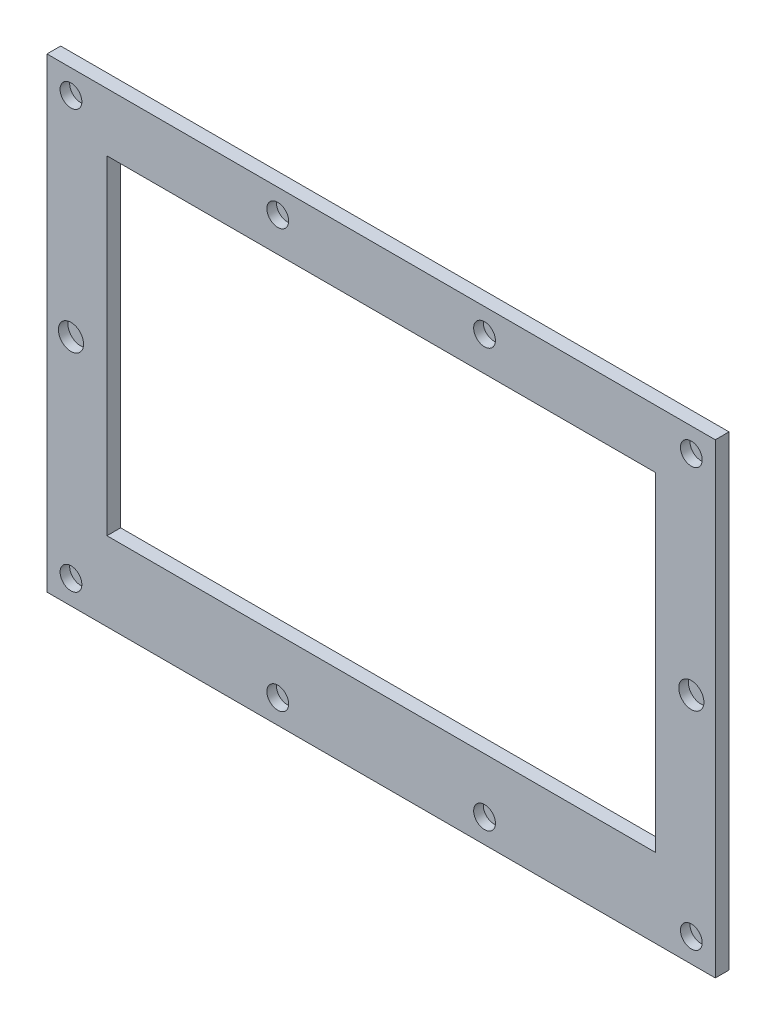
ISO-10303-21;
HEADER;
FILE_DESCRIPTION(('STEP AP214'),'2;1');
FILE_NAME('part.step','',(''),(''),'','','');
FILE_SCHEMA(('AUTOMOTIVE_DESIGN { 1 0 10303 214 1 1 1 1 }'));
ENDSEC;
DATA;
#1=APPLICATION_CONTEXT('core data for automotive mechanical design processes');
#2=APPLICATION_PROTOCOL_DEFINITION('international standard','automotive_design',2000,#1);
#3=PRODUCT_CONTEXT('',#1,'mechanical');
#4=PRODUCT('Part','Part','',(#3));
#5=PRODUCT_RELATED_PRODUCT_CATEGORY('part','',(#4));
#6=PRODUCT_DEFINITION_FORMATION('','',#4);
#7=PRODUCT_DEFINITION_CONTEXT('part definition',#1,'design');
#8=PRODUCT_DEFINITION('design','',#6,#7);
#9=PRODUCT_DEFINITION_SHAPE('','',#8);
#10=(LENGTH_UNIT() NAMED_UNIT(*) SI_UNIT(.MILLI.,.METRE.));
#11=(NAMED_UNIT(*) PLANE_ANGLE_UNIT() SI_UNIT($,.RADIAN.));
#12=(NAMED_UNIT(*) SI_UNIT($,.STERADIAN.) SOLID_ANGLE_UNIT());
#13=UNCERTAINTY_MEASURE_WITH_UNIT(LENGTH_MEASURE(1.E-05),#10,'distance_accuracy_value','');
#14=(GEOMETRIC_REPRESENTATION_CONTEXT(3) GLOBAL_UNCERTAINTY_ASSIGNED_CONTEXT((#13)) GLOBAL_UNIT_ASSIGNED_CONTEXT((#10,
#11,#12)) REPRESENTATION_CONTEXT('',''));
#15=CARTESIAN_POINT('',(0.,0.,0.));
#16=DIRECTION('',(0.,0.,1.));
#17=DIRECTION('',(1.,0.,0.));
#18=AXIS2_PLACEMENT_3D('',#15,#16,#17);
#19=CARTESIAN_POINT('',(0.,68.,-2.));
#20=DIRECTION('',(0.,1.,0.));
#21=DIRECTION('',(0.,0.,1.));
#22=AXIS2_PLACEMENT_3D('',#19,#20,#21);
#23=PLANE('',#22);
#24=DIRECTION('',(0.,0.,1.));
#25=VECTOR('',#24,1.);
#26=CARTESIAN_POINT('',(-97.5,68.,-2.));
#27=LINE('',#26,#25);
#28=CARTESIAN_POINT('',(-97.5,68.,-2.));
#29=VERTEX_POINT('',#28);
#30=CARTESIAN_POINT('',(-97.5,68.,2.));
#31=VERTEX_POINT('',#30);
#32=EDGE_CURVE('E109',#29,#31,#27,.T.);
#33=ORIENTED_EDGE('',*,*,#32,.T.);
#34=DIRECTION('',(-1.,0.,0.));
#35=VECTOR('',#34,1.);
#36=CARTESIAN_POINT('',(0.,68.,2.));
#37=LINE('',#36,#35);
#38=CARTESIAN_POINT('',(97.4999999999999,68.,2.));
#39=VERTEX_POINT('',#38);
#40=EDGE_CURVE('E112',#39,#31,#37,.T.);
#41=ORIENTED_EDGE('',*,*,#40,.F.);
#42=DIRECTION('',(0.,0.,1.));
#43=VECTOR('',#42,1.);
#44=CARTESIAN_POINT('',(97.4999999999999,68.,-2.));
#45=LINE('',#44,#43);
#46=CARTESIAN_POINT('',(97.4999999999999,68.,-2.));
#47=VERTEX_POINT('',#46);
#48=EDGE_CURVE('E11',#47,#39,#45,.T.);
#49=ORIENTED_EDGE('',*,*,#48,.F.);
#50=DIRECTION('',(-1.,0.,0.));
#51=VECTOR('',#50,1.);
#52=CARTESIAN_POINT('',(0.,68.,-2.));
#53=LINE('',#52,#51);
#54=EDGE_CURVE('E115',#47,#29,#53,.T.);
#55=ORIENTED_EDGE('',*,*,#54,.T.);
#56=EDGE_LOOP('',(#33,#41,#49,#55));
#57=FACE_BOUND('',#56,.T.);
#58=ADVANCED_FACE('F45',(#57),#23,.T.);
#59=CARTESIAN_POINT('',(97.4999999999999,0.,-2.));
#60=DIRECTION('',(-1.,0.,0.));
#61=DIRECTION('',(0.,0.,1.));
#62=AXIS2_PLACEMENT_3D('',#59,#60,#61);
#63=PLANE('',#62);
#64=ORIENTED_EDGE('',*,*,#48,.T.);
#65=DIRECTION('',(0.,-1.,0.));
#66=VECTOR('',#65,1.);
#67=CARTESIAN_POINT('',(97.4999999999999,0.,2.));
#68=LINE('',#67,#66);
#69=CARTESIAN_POINT('',(97.4999999999999,-68.,2.));
#70=VERTEX_POINT('',#69);
#71=EDGE_CURVE('E135',#39,#70,#68,.T.);
#72=ORIENTED_EDGE('',*,*,#71,.T.);
#73=DIRECTION('',(0.,0.,1.));
#74=VECTOR('',#73,1.);
#75=CARTESIAN_POINT('',(97.4999999999999,-68.,-2.));
#76=LINE('',#75,#74);
#77=CARTESIAN_POINT('',(97.4999999999999,-68.,-2.));
#78=VERTEX_POINT('',#77);
#79=EDGE_CURVE('E55',#78,#70,#76,.T.);
#80=ORIENTED_EDGE('',*,*,#79,.F.);
#81=DIRECTION('',(0.,-1.,0.));
#82=VECTOR('',#81,1.);
#83=CARTESIAN_POINT('',(97.4999999999999,0.,-2.));
#84=LINE('',#83,#82);
#85=EDGE_CURVE('E186',#47,#78,#84,.T.);
#86=ORIENTED_EDGE('',*,*,#85,.F.);
#87=EDGE_LOOP('',(#64,#72,#80,#86));
#88=FACE_BOUND('',#87,.T.);
#89=ADVANCED_FACE('F228',(#88),#63,.F.);
#90=CARTESIAN_POINT('',(0.,-68.,-2.));
#91=DIRECTION('',(0.,1.,0.));
#92=DIRECTION('',(0.,0.,1.));
#93=AXIS2_PLACEMENT_3D('',#90,#91,#92);
#94=PLANE('',#93);
#95=ORIENTED_EDGE('',*,*,#79,.T.);
#96=DIRECTION('',(-1.,0.,0.));
#97=VECTOR('',#96,1.);
#98=CARTESIAN_POINT('',(0.,-68.,2.));
#99=LINE('',#98,#97);
#100=CARTESIAN_POINT('',(-97.5,-68.,2.));
#101=VERTEX_POINT('',#100);
#102=EDGE_CURVE('E130',#70,#101,#99,.T.);
#103=ORIENTED_EDGE('',*,*,#102,.T.);
#104=DIRECTION('',(0.,0.,1.));
#105=VECTOR('',#104,1.);
#106=CARTESIAN_POINT('',(-97.5,-68.,-2.));
#107=LINE('',#106,#105);
#108=CARTESIAN_POINT('',(-97.5,-68.,-2.));
#109=VERTEX_POINT('',#108);
#110=EDGE_CURVE('E120',#109,#101,#107,.T.);
#111=ORIENTED_EDGE('',*,*,#110,.F.);
#112=DIRECTION('',(-1.,0.,0.));
#113=VECTOR('',#112,1.);
#114=CARTESIAN_POINT('',(0.,-68.,-2.));
#115=LINE('',#114,#113);
#116=EDGE_CURVE('E69',#78,#109,#115,.T.);
#117=ORIENTED_EDGE('',*,*,#116,.F.);
#118=EDGE_LOOP('',(#95,#103,#111,#117));
#119=FACE_BOUND('',#118,.T.);
#120=ADVANCED_FACE('F233',(#119),#94,.F.);
#121=CARTESIAN_POINT('',(0.,-45.,-2.));
#122=DIRECTION('',(0.,1.,0.));
#123=DIRECTION('',(-1.,0.,0.));
#124=AXIS2_PLACEMENT_3D('',#121,#122,#123);
#125=PLANE('',#124);
#126=DIRECTION('',(0.,0.,1.));
#127=VECTOR('',#126,1.);
#128=CARTESIAN_POINT('',(-80.,-45.,-2.));
#129=LINE('',#128,#127);
#130=CARTESIAN_POINT('',(-80.,-45.,-2.));
#131=VERTEX_POINT('',#130);
#132=CARTESIAN_POINT('',(-80.,-45.,2.));
#133=VERTEX_POINT('',#132);
#134=EDGE_CURVE('E49',#131,#133,#129,.T.);
#135=ORIENTED_EDGE('',*,*,#134,.T.);
#136=DIRECTION('',(-1.,0.,0.));
#137=VECTOR('',#136,1.);
#138=CARTESIAN_POINT('',(0.,-45.,2.));
#139=LINE('',#138,#137);
#140=CARTESIAN_POINT('',(80.,-45.,2.));
#141=VERTEX_POINT('',#140);
#142=EDGE_CURVE('E149',#141,#133,#139,.T.);
#143=ORIENTED_EDGE('',*,*,#142,.F.);
#144=DIRECTION('',(0.,0.,1.));
#145=VECTOR('',#144,1.);
#146=CARTESIAN_POINT('',(80.,-45.,-2.));
#147=LINE('',#146,#145);
#148=CARTESIAN_POINT('',(80.,-45.,-2.));
#149=VERTEX_POINT('',#148);
#150=EDGE_CURVE('E121',#149,#141,#147,.T.);
#151=ORIENTED_EDGE('',*,*,#150,.F.);
#152=DIRECTION('',(-1.,0.,0.));
#153=VECTOR('',#152,1.);
#154=CARTESIAN_POINT('',(0.,-45.,-2.));
#155=LINE('',#154,#153);
#156=EDGE_CURVE('E165',#149,#131,#155,.T.);
#157=ORIENTED_EDGE('',*,*,#156,.T.);
#158=EDGE_LOOP('',(#135,#143,#151,#157));
#159=FACE_BOUND('',#158,.T.);
#160=ADVANCED_FACE('F47',(#159),#125,.T.);
#161=CARTESIAN_POINT('',(80.,0.,-2.));
#162=DIRECTION('',(1.,0.,0.));
#163=DIRECTION('',(0.,0.,-1.));
#164=AXIS2_PLACEMENT_3D('',#161,#162,#163);
#165=PLANE('',#164);
#166=ORIENTED_EDGE('',*,*,#150,.T.);
#167=DIRECTION('',(0.,1.,0.));
#168=VECTOR('',#167,1.);
#169=CARTESIAN_POINT('',(80.,0.,2.));
#170=LINE('',#169,#168);
#171=CARTESIAN_POINT('',(80.,51.,2.));
#172=VERTEX_POINT('',#171);
#173=EDGE_CURVE('E161',#141,#172,#170,.T.);
#174=ORIENTED_EDGE('',*,*,#173,.T.);
#175=DIRECTION('',(0.,0.,1.));
#176=VECTOR('',#175,1.);
#177=CARTESIAN_POINT('',(80.,51.,-2.));
#178=LINE('',#177,#176);
#179=CARTESIAN_POINT('',(80.,51.,-2.));
#180=VERTEX_POINT('',#179);
#181=EDGE_CURVE('E195',#180,#172,#178,.T.);
#182=ORIENTED_EDGE('',*,*,#181,.F.);
#183=DIRECTION('',(0.,1.,0.));
#184=VECTOR('',#183,1.);
#185=CARTESIAN_POINT('',(80.,0.,-2.));
#186=LINE('',#185,#184);
#187=EDGE_CURVE('E176',#149,#180,#186,.T.);
#188=ORIENTED_EDGE('',*,*,#187,.F.);
#189=EDGE_LOOP('',(#166,#174,#182,#188));
#190=FACE_BOUND('',#189,.T.);
#191=ADVANCED_FACE('F212',(#190),#165,.F.);
#192=CARTESIAN_POINT('',(0.,51.,-2.));
#193=DIRECTION('',(0.,1.,0.));
#194=DIRECTION('',(-1.,0.,0.));
#195=AXIS2_PLACEMENT_3D('',#192,#193,#194);
#196=PLANE('',#195);
#197=ORIENTED_EDGE('',*,*,#181,.T.);
#198=DIRECTION('',(-1.,0.,0.));
#199=VECTOR('',#198,1.);
#200=CARTESIAN_POINT('',(0.,51.,2.));
#201=LINE('',#200,#199);
#202=CARTESIAN_POINT('',(-80.,51.,2.));
#203=VERTEX_POINT('',#202);
#204=EDGE_CURVE('E157',#172,#203,#201,.T.);
#205=ORIENTED_EDGE('',*,*,#204,.T.);
#206=DIRECTION('',(0.,0.,1.));
#207=VECTOR('',#206,1.);
#208=CARTESIAN_POINT('',(-80.,51.,-2.));
#209=LINE('',#208,#207);
#210=CARTESIAN_POINT('',(-80.,51.,-2.));
#211=VERTEX_POINT('',#210);
#212=EDGE_CURVE('E197',#211,#203,#209,.T.);
#213=ORIENTED_EDGE('',*,*,#212,.F.);
#214=DIRECTION('',(-1.,0.,0.));
#215=VECTOR('',#214,1.);
#216=CARTESIAN_POINT('',(0.,51.,-2.));
#217=LINE('',#216,#215);
#218=EDGE_CURVE('E173',#180,#211,#217,.T.);
#219=ORIENTED_EDGE('',*,*,#218,.F.);
#220=EDGE_LOOP('',(#197,#205,#213,#219));
#221=FACE_BOUND('',#220,.T.);
#222=ADVANCED_FACE('F219',(#221),#196,.F.);
#223=CARTESIAN_POINT('',(-80.,0.,-2.));
#224=DIRECTION('',(1.,0.,0.));
#225=DIRECTION('',(0.,0.,-1.));
#226=AXIS2_PLACEMENT_3D('',#223,#224,#225);
#227=PLANE('',#226);
#228=ORIENTED_EDGE('',*,*,#212,.T.);
#229=DIRECTION('',(0.,1.,0.));
#230=VECTOR('',#229,1.);
#231=CARTESIAN_POINT('',(-80.,0.,2.));
#232=LINE('',#231,#230);
#233=EDGE_CURVE('E153',#133,#203,#232,.T.);
#234=ORIENTED_EDGE('',*,*,#233,.F.);
#235=ORIENTED_EDGE('',*,*,#134,.F.);
#236=DIRECTION('',(0.,1.,0.));
#237=VECTOR('',#236,1.);
#238=CARTESIAN_POINT('',(-80.,0.,-2.));
#239=LINE('',#238,#237);
#240=EDGE_CURVE('E169',#131,#211,#239,.T.);
#241=ORIENTED_EDGE('',*,*,#240,.T.);
#242=EDGE_LOOP('',(#228,#234,#235,#241));
#243=FACE_BOUND('',#242,.T.);
#244=ADVANCED_FACE('F208',(#243),#227,.T.);
#245=CARTESIAN_POINT('',(-97.5,0.,-2.));
#246=DIRECTION('',(-1.,0.,0.));
#247=DIRECTION('',(0.,0.,1.));
#248=AXIS2_PLACEMENT_3D('',#245,#246,#247);
#249=PLANE('',#248);
#250=ORIENTED_EDGE('',*,*,#110,.T.);
#251=DIRECTION('',(0.,-1.,0.));
#252=VECTOR('',#251,1.);
#253=CARTESIAN_POINT('',(-97.5,0.,2.));
#254=LINE('',#253,#252);
#255=EDGE_CURVE('E124',#31,#101,#254,.T.);
#256=ORIENTED_EDGE('',*,*,#255,.F.);
#257=ORIENTED_EDGE('',*,*,#32,.F.);
#258=DIRECTION('',(0.,-1.,0.));
#259=VECTOR('',#258,1.);
#260=CARTESIAN_POINT('',(-97.5,0.,-2.));
#261=LINE('',#260,#259);
#262=EDGE_CURVE('E181',#29,#109,#261,.T.);
#263=ORIENTED_EDGE('',*,*,#262,.T.);
#264=EDGE_LOOP('',(#250,#256,#257,#263));
#265=FACE_BOUND('',#264,.T.);
#266=ADVANCED_FACE('F125',(#265),#249,.T.);
#267=CARTESIAN_POINT('',(0.,0.,-2.));
#268=DIRECTION('',(0.,0.,1.));
#269=DIRECTION('',(1.,0.,0.));
#270=AXIS2_PLACEMENT_3D('',#267,#268,#269);
#271=PLANE('',#270);
#272=ORIENTED_EDGE('',*,*,#156,.F.);
#273=ORIENTED_EDGE('',*,*,#187,.T.);
#274=ORIENTED_EDGE('',*,*,#218,.T.);
#275=ORIENTED_EDGE('',*,*,#240,.F.);
#276=EDGE_LOOP('',(#272,#273,#274,#275));
#277=FACE_BOUND('',#276,.T.);
#278=ORIENTED_EDGE('',*,*,#54,.F.);
#279=ORIENTED_EDGE('',*,*,#85,.T.);
#280=ORIENTED_EDGE('',*,*,#116,.T.);
#281=ORIENTED_EDGE('',*,*,#262,.F.);
#282=EDGE_LOOP('',(#278,#279,#280,#281));
#283=FACE_BOUND('',#282,.T.);
#284=ADVANCED_FACE('F216',(#277,#283),#271,.F.);
#285=CARTESIAN_POINT('',(0.,0.,2.));
#286=DIRECTION('',(0.,0.,1.));
#287=DIRECTION('',(1.,0.,0.));
#288=AXIS2_PLACEMENT_3D('',#285,#286,#287);
#289=PLANE('',#288);
#290=CARTESIAN_POINT('',(-30.1666666666667,61.,2.));
#291=DIRECTION('',(0.,0.,1.));
#292=DIRECTION('',(1.,0.,0.));
#293=AXIS2_PLACEMENT_3D('',#290,#291,#292);
#294=CIRCLE('',#293,3.175);
#295=CARTESIAN_POINT('',(-26.9916666666667,61.,2.));
#296=VERTEX_POINT('',#295);
#297=EDGE_CURVE('E341',#296,#296,#294,.T.);
#298=ORIENTED_EDGE('',*,*,#297,.F.);
#299=EDGE_LOOP('',(#298));
#300=FACE_BOUND('',#299,.T.);
#301=CARTESIAN_POINT('',(90.5,0.,2.));
#302=DIRECTION('',(0.,0.,1.));
#303=DIRECTION('',(1.,0.,0.));
#304=AXIS2_PLACEMENT_3D('',#301,#302,#303);
#305=CIRCLE('',#304,3.67372256576082);
#306=CARTESIAN_POINT('',(94.1737225657609,0.,2.));
#307=VERTEX_POINT('',#306);
#308=EDGE_CURVE('E362',#307,#307,#305,.T.);
#309=ORIENTED_EDGE('',*,*,#308,.F.);
#310=EDGE_LOOP('',(#309));
#311=FACE_BOUND('',#310,.T.);
#312=CARTESIAN_POINT('',(30.1666666666666,-61.,2.));
#313=DIRECTION('',(0.,0.,1.));
#314=DIRECTION('',(1.,0.,0.));
#315=AXIS2_PLACEMENT_3D('',#312,#313,#314);
#316=CIRCLE('',#315,3.175);
#317=CARTESIAN_POINT('',(33.3416666666666,-61.,2.));
#318=VERTEX_POINT('',#317);
#319=EDGE_CURVE('E354',#318,#318,#316,.T.);
#320=ORIENTED_EDGE('',*,*,#319,.F.);
#321=EDGE_LOOP('',(#320));
#322=FACE_BOUND('',#321,.T.);
#323=CARTESIAN_POINT('',(-90.5,-61.,2.));
#324=DIRECTION('',(0.,0.,1.));
#325=DIRECTION('',(1.,0.,0.));
#326=AXIS2_PLACEMENT_3D('',#323,#324,#325);
#327=CIRCLE('',#326,3.175);
#328=CARTESIAN_POINT('',(-87.325,-61.,2.));
#329=VERTEX_POINT('',#328);
#330=EDGE_CURVE('E345',#329,#329,#327,.T.);
#331=ORIENTED_EDGE('',*,*,#330,.F.);
#332=EDGE_LOOP('',(#331));
#333=FACE_BOUND('',#332,.T.);
#334=CARTESIAN_POINT('',(-30.1666666666667,-61.,2.));
#335=DIRECTION('',(0.,0.,1.));
#336=DIRECTION('',(1.,0.,0.));
#337=AXIS2_PLACEMENT_3D('',#334,#335,#336);
#338=CIRCLE('',#337,3.175);
#339=CARTESIAN_POINT('',(-26.9916666666667,-61.,2.));
#340=VERTEX_POINT('',#339);
#341=EDGE_CURVE('E397',#340,#340,#338,.T.);
#342=ORIENTED_EDGE('',*,*,#341,.F.);
#343=EDGE_LOOP('',(#342));
#344=FACE_BOUND('',#343,.T.);
#345=CARTESIAN_POINT('',(90.5,-61.,2.));
#346=DIRECTION('',(0.,0.,1.));
#347=DIRECTION('',(1.,0.,0.));
#348=AXIS2_PLACEMENT_3D('',#345,#346,#347);
#349=CIRCLE('',#348,3.175);
#350=CARTESIAN_POINT('',(93.675,-61.,2.));
#351=VERTEX_POINT('',#350);
#352=EDGE_CURVE('E389',#351,#351,#349,.T.);
#353=ORIENTED_EDGE('',*,*,#352,.F.);
#354=EDGE_LOOP('',(#353));
#355=FACE_BOUND('',#354,.T.);
#356=CARTESIAN_POINT('',(90.5,61.,2.));
#357=DIRECTION('',(0.,0.,1.));
#358=DIRECTION('',(1.,0.,0.));
#359=AXIS2_PLACEMENT_3D('',#356,#357,#358);
#360=CIRCLE('',#359,3.175);
#361=CARTESIAN_POINT('',(93.675,61.,2.));
#362=VERTEX_POINT('',#361);
#363=EDGE_CURVE('E381',#362,#362,#360,.T.);
#364=ORIENTED_EDGE('',*,*,#363,.F.);
#365=EDGE_LOOP('',(#364));
#366=FACE_BOUND('',#365,.T.);
#367=CARTESIAN_POINT('',(-90.5,0.,2.));
#368=DIRECTION('',(0.,0.,1.));
#369=DIRECTION('',(1.,0.,0.));
#370=AXIS2_PLACEMENT_3D('',#367,#368,#369);
#371=CIRCLE('',#370,3.67372256576082);
#372=CARTESIAN_POINT('',(-86.8262774342392,0.,2.));
#373=VERTEX_POINT('',#372);
#374=EDGE_CURVE('E373',#373,#373,#371,.T.);
#375=ORIENTED_EDGE('',*,*,#374,.F.);
#376=EDGE_LOOP('',(#375));
#377=FACE_BOUND('',#376,.T.);
#378=CARTESIAN_POINT('',(30.1666666666666,61.,2.));
#379=DIRECTION('',(0.,0.,1.));
#380=DIRECTION('',(1.,0.,0.));
#381=AXIS2_PLACEMENT_3D('',#378,#379,#380);
#382=CIRCLE('',#381,3.175);
#383=CARTESIAN_POINT('',(33.3416666666666,61.,2.));
#384=VERTEX_POINT('',#383);
#385=EDGE_CURVE('E333',#384,#384,#382,.T.);
#386=ORIENTED_EDGE('',*,*,#385,.F.);
#387=EDGE_LOOP('',(#386));
#388=FACE_BOUND('',#387,.T.);
#389=CARTESIAN_POINT('',(-90.5,61.,2.));
#390=DIRECTION('',(0.,0.,1.));
#391=DIRECTION('',(1.,0.,0.));
#392=AXIS2_PLACEMENT_3D('',#389,#390,#391);
#393=CIRCLE('',#392,3.175);
#394=CARTESIAN_POINT('',(-87.325,61.,2.));
#395=VERTEX_POINT('',#394);
#396=EDGE_CURVE('E141',#395,#395,#393,.T.);
#397=ORIENTED_EDGE('',*,*,#396,.F.);
#398=EDGE_LOOP('',(#397));
#399=FACE_BOUND('',#398,.T.);
#400=ORIENTED_EDGE('',*,*,#40,.T.);
#401=ORIENTED_EDGE('',*,*,#255,.T.);
#402=ORIENTED_EDGE('',*,*,#102,.F.);
#403=ORIENTED_EDGE('',*,*,#71,.F.);
#404=EDGE_LOOP('',(#400,#401,#402,#403));
#405=FACE_BOUND('',#404,.T.);
#406=ORIENTED_EDGE('',*,*,#142,.T.);
#407=ORIENTED_EDGE('',*,*,#233,.T.);
#408=ORIENTED_EDGE('',*,*,#204,.F.);
#409=ORIENTED_EDGE('',*,*,#173,.F.);
#410=EDGE_LOOP('',(#406,#407,#408,#409));
#411=FACE_BOUND('',#410,.T.);
#412=ADVANCED_FACE('F132',(#300,#311,#322,#333,#344,#355,#366,#377,#388,#399,#405,#411),#289,.T.);
#413=CARTESIAN_POINT('',(-90.5,61.,-0.794));
#414=DIRECTION('',(0.,0.,1.));
#415=DIRECTION('',(1.,0.,0.));
#416=AXIS2_PLACEMENT_3D('',#413,#414,#415);
#417=CYLINDRICAL_SURFACE('',#416,3.175);
#418=CARTESIAN_POINT('',(-90.5,61.,-0.794));
#419=DIRECTION('',(0.,0.,1.));
#420=DIRECTION('',(1.,0.,0.));
#421=AXIS2_PLACEMENT_3D('',#418,#419,#420);
#422=CIRCLE('',#421,3.175);
#423=CARTESIAN_POINT('',(-87.325,61.,-0.794));
#424=VERTEX_POINT('',#423);
#425=EDGE_CURVE('E137',#424,#424,#422,.T.);
#426=ORIENTED_EDGE('',*,*,#425,.F.);
#427=EDGE_LOOP('',(#426));
#428=FACE_BOUND('',#427,.T.);
#429=ORIENTED_EDGE('',*,*,#396,.T.);
#430=EDGE_LOOP('',(#429));
#431=FACE_BOUND('',#430,.T.);
#432=ADVANCED_FACE('F245',(#428,#431),#417,.F.);
#433=CARTESIAN_POINT('',(-90.5,61.,-0.794));
#434=DIRECTION('',(0.,0.,1.));
#435=DIRECTION('',(1.,0.,0.));
#436=AXIS2_PLACEMENT_3D('',#433,#434,#435);
#437=PLANE('',#436);
#438=ORIENTED_EDGE('',*,*,#425,.T.);
#439=EDGE_LOOP('',(#438));
#440=FACE_BOUND('',#439,.T.);
#441=ADVANCED_FACE('F249',(#440),#437,.T.);
#442=CARTESIAN_POINT('',(30.1666666666666,61.,-0.794));
#443=DIRECTION('',(0.,0.,1.));
#444=DIRECTION('',(1.,0.,0.));
#445=AXIS2_PLACEMENT_3D('',#442,#443,#444);
#446=CYLINDRICAL_SURFACE('',#445,3.175);
#447=CARTESIAN_POINT('',(30.1666666666666,61.,-0.794));
#448=DIRECTION('',(0.,0.,1.));
#449=DIRECTION('',(1.,0.,0.));
#450=AXIS2_PLACEMENT_3D('',#447,#448,#449);
#451=CIRCLE('',#450,3.175);
#452=CARTESIAN_POINT('',(33.3416666666666,61.,-0.794));
#453=VERTEX_POINT('',#452);
#454=EDGE_CURVE('E330',#453,#453,#451,.T.);
#455=ORIENTED_EDGE('',*,*,#454,.F.);
#456=EDGE_LOOP('',(#455));
#457=FACE_BOUND('',#456,.T.);
#458=ORIENTED_EDGE('',*,*,#385,.T.);
#459=EDGE_LOOP('',(#458));
#460=FACE_BOUND('',#459,.T.);
#461=ADVANCED_FACE('F253',(#457,#460),#446,.F.);
#462=CARTESIAN_POINT('',(30.1666666666666,61.,-0.794));
#463=DIRECTION('',(0.,0.,1.));
#464=DIRECTION('',(1.,0.,0.));
#465=AXIS2_PLACEMENT_3D('',#462,#463,#464);
#466=PLANE('',#465);
#467=ORIENTED_EDGE('',*,*,#454,.T.);
#468=EDGE_LOOP('',(#467));
#469=FACE_BOUND('',#468,.T.);
#470=ADVANCED_FACE('F287',(#469),#466,.T.);
#471=CARTESIAN_POINT('',(-90.5,0.,-0.794));
#472=DIRECTION('',(0.,0.,1.));
#473=DIRECTION('',(1.,0.,0.));
#474=AXIS2_PLACEMENT_3D('',#471,#472,#473);
#475=CYLINDRICAL_SURFACE('',#474,3.67372256576082);
#476=CARTESIAN_POINT('',(-90.5,0.,-0.794));
#477=DIRECTION('',(0.,0.,1.));
#478=DIRECTION('',(1.,0.,0.));
#479=AXIS2_PLACEMENT_3D('',#476,#477,#478);
#480=CIRCLE('',#479,3.67372256576082);
#481=CARTESIAN_POINT('',(-86.8262774342392,0.,-0.794));
#482=VERTEX_POINT('',#481);
#483=EDGE_CURVE('E377',#482,#482,#480,.T.);
#484=ORIENTED_EDGE('',*,*,#483,.F.);
#485=EDGE_LOOP('',(#484));
#486=FACE_BOUND('',#485,.T.);
#487=ORIENTED_EDGE('',*,*,#374,.T.);
#488=EDGE_LOOP('',(#487));
#489=FACE_BOUND('',#488,.T.);
#490=ADVANCED_FACE('F283',(#486,#489),#475,.F.);
#491=CARTESIAN_POINT('',(-90.5,0.,-0.794));
#492=DIRECTION('',(0.,0.,1.));
#493=DIRECTION('',(1.,0.,0.));
#494=AXIS2_PLACEMENT_3D('',#491,#492,#493);
#495=PLANE('',#494);
#496=ORIENTED_EDGE('',*,*,#483,.T.);
#497=EDGE_LOOP('',(#496));
#498=FACE_BOUND('',#497,.T.);
#499=ADVANCED_FACE('F279',(#498),#495,.T.);
#500=CARTESIAN_POINT('',(90.5,61.,-0.794));
#501=DIRECTION('',(0.,0.,1.));
#502=DIRECTION('',(1.,0.,0.));
#503=AXIS2_PLACEMENT_3D('',#500,#501,#502);
#504=CYLINDRICAL_SURFACE('',#503,3.175);
#505=CARTESIAN_POINT('',(90.5,61.,-0.794));
#506=DIRECTION('',(0.,0.,1.));
#507=DIRECTION('',(1.,0.,0.));
#508=AXIS2_PLACEMENT_3D('',#505,#506,#507);
#509=CIRCLE('',#508,3.175);
#510=CARTESIAN_POINT('',(93.675,61.,-0.794));
#511=VERTEX_POINT('',#510);
#512=EDGE_CURVE('E385',#511,#511,#509,.T.);
#513=ORIENTED_EDGE('',*,*,#512,.F.);
#514=EDGE_LOOP('',(#513));
#515=FACE_BOUND('',#514,.T.);
#516=ORIENTED_EDGE('',*,*,#363,.T.);
#517=EDGE_LOOP('',(#516));
#518=FACE_BOUND('',#517,.T.);
#519=ADVANCED_FACE('F275',(#515,#518),#504,.F.);
#520=CARTESIAN_POINT('',(90.5,61.,-0.794));
#521=DIRECTION('',(0.,0.,1.));
#522=DIRECTION('',(1.,0.,0.));
#523=AXIS2_PLACEMENT_3D('',#520,#521,#522);
#524=PLANE('',#523);
#525=ORIENTED_EDGE('',*,*,#512,.T.);
#526=EDGE_LOOP('',(#525));
#527=FACE_BOUND('',#526,.T.);
#528=ADVANCED_FACE('F271',(#527),#524,.T.);
#529=CARTESIAN_POINT('',(90.5,-61.,-0.794));
#530=DIRECTION('',(0.,0.,1.));
#531=DIRECTION('',(1.,0.,0.));
#532=AXIS2_PLACEMENT_3D('',#529,#530,#531);
#533=CYLINDRICAL_SURFACE('',#532,3.175);
#534=CARTESIAN_POINT('',(90.5,-61.,-0.794));
#535=DIRECTION('',(0.,0.,1.));
#536=DIRECTION('',(1.,0.,0.));
#537=AXIS2_PLACEMENT_3D('',#534,#535,#536);
#538=CIRCLE('',#537,3.175);
#539=CARTESIAN_POINT('',(93.675,-61.,-0.794));
#540=VERTEX_POINT('',#539);
#541=EDGE_CURVE('E393',#540,#540,#538,.T.);
#542=ORIENTED_EDGE('',*,*,#541,.F.);
#543=EDGE_LOOP('',(#542));
#544=FACE_BOUND('',#543,.T.);
#545=ORIENTED_EDGE('',*,*,#352,.T.);
#546=EDGE_LOOP('',(#545));
#547=FACE_BOUND('',#546,.T.);
#548=ADVANCED_FACE('F267',(#544,#547),#533,.F.);
#549=CARTESIAN_POINT('',(90.5,-61.,-0.794));
#550=DIRECTION('',(0.,0.,1.));
#551=DIRECTION('',(1.,0.,0.));
#552=AXIS2_PLACEMENT_3D('',#549,#550,#551);
#553=PLANE('',#552);
#554=ORIENTED_EDGE('',*,*,#541,.T.);
#555=EDGE_LOOP('',(#554));
#556=FACE_BOUND('',#555,.T.);
#557=ADVANCED_FACE('F263',(#556),#553,.T.);
#558=CARTESIAN_POINT('',(-30.1666666666667,-61.,-0.794));
#559=DIRECTION('',(0.,0.,1.));
#560=DIRECTION('',(1.,0.,0.));
#561=AXIS2_PLACEMENT_3D('',#558,#559,#560);
#562=CYLINDRICAL_SURFACE('',#561,3.175);
#563=CARTESIAN_POINT('',(-30.1666666666667,-61.,-0.794));
#564=DIRECTION('',(0.,0.,1.));
#565=DIRECTION('',(1.,0.,0.));
#566=AXIS2_PLACEMENT_3D('',#563,#564,#565);
#567=CIRCLE('',#566,3.175);
#568=CARTESIAN_POINT('',(-26.9916666666667,-61.,-0.794));
#569=VERTEX_POINT('',#568);
#570=EDGE_CURVE('E349',#569,#569,#567,.T.);
#571=ORIENTED_EDGE('',*,*,#570,.F.);
#572=EDGE_LOOP('',(#571));
#573=FACE_BOUND('',#572,.T.);
#574=ORIENTED_EDGE('',*,*,#341,.T.);
#575=EDGE_LOOP('',(#574));
#576=FACE_BOUND('',#575,.T.);
#577=ADVANCED_FACE('F259',(#573,#576),#562,.F.);
#578=CARTESIAN_POINT('',(-30.1666666666667,-61.,-0.794));
#579=DIRECTION('',(0.,0.,1.));
#580=DIRECTION('',(1.,0.,0.));
#581=AXIS2_PLACEMENT_3D('',#578,#579,#580);
#582=PLANE('',#581);
#583=ORIENTED_EDGE('',*,*,#570,.T.);
#584=EDGE_LOOP('',(#583));
#585=FACE_BOUND('',#584,.T.);
#586=ADVANCED_FACE('F255',(#585),#582,.T.);
#587=CARTESIAN_POINT('',(-90.5,-61.,-0.794));
#588=DIRECTION('',(0.,0.,1.));
#589=DIRECTION('',(1.,0.,0.));
#590=AXIS2_PLACEMENT_3D('',#587,#588,#589);
#591=CYLINDRICAL_SURFACE('',#590,3.175);
#592=CARTESIAN_POINT('',(-90.5,-61.,-0.794));
#593=DIRECTION('',(0.,0.,1.));
#594=DIRECTION('',(1.,0.,0.));
#595=AXIS2_PLACEMENT_3D('',#592,#593,#594);
#596=CIRCLE('',#595,3.175);
#597=CARTESIAN_POINT('',(-87.325,-61.,-0.794));
#598=VERTEX_POINT('',#597);
#599=EDGE_CURVE('E350',#598,#598,#596,.T.);
#600=ORIENTED_EDGE('',*,*,#599,.F.);
#601=EDGE_LOOP('',(#600));
#602=FACE_BOUND('',#601,.T.);
#603=ORIENTED_EDGE('',*,*,#330,.T.);
#604=EDGE_LOOP('',(#603));
#605=FACE_BOUND('',#604,.T.);
#606=ADVANCED_FACE('F258',(#602,#605),#591,.F.);
#607=CARTESIAN_POINT('',(-90.5,-61.,-0.794));
#608=DIRECTION('',(0.,0.,1.));
#609=DIRECTION('',(1.,0.,0.));
#610=AXIS2_PLACEMENT_3D('',#607,#608,#609);
#611=PLANE('',#610);
#612=ORIENTED_EDGE('',*,*,#599,.T.);
#613=EDGE_LOOP('',(#612));
#614=FACE_BOUND('',#613,.T.);
#615=ADVANCED_FACE('F312',(#614),#611,.T.);
#616=CARTESIAN_POINT('',(30.1666666666666,-61.,-0.794));
#617=DIRECTION('',(0.,0.,1.));
#618=DIRECTION('',(1.,0.,0.));
#619=AXIS2_PLACEMENT_3D('',#616,#617,#618);
#620=CYLINDRICAL_SURFACE('',#619,3.175);
#621=CARTESIAN_POINT('',(30.1666666666666,-61.,-0.794));
#622=DIRECTION('',(0.,0.,1.));
#623=DIRECTION('',(1.,0.,0.));
#624=AXIS2_PLACEMENT_3D('',#621,#622,#623);
#625=CIRCLE('',#624,3.175);
#626=CARTESIAN_POINT('',(33.3416666666666,-61.,-0.794));
#627=VERTEX_POINT('',#626);
#628=EDGE_CURVE('E358',#627,#627,#625,.T.);
#629=ORIENTED_EDGE('',*,*,#628,.F.);
#630=EDGE_LOOP('',(#629));
#631=FACE_BOUND('',#630,.T.);
#632=ORIENTED_EDGE('',*,*,#319,.T.);
#633=EDGE_LOOP('',(#632));
#634=FACE_BOUND('',#633,.T.);
#635=ADVANCED_FACE('F308',(#631,#634),#620,.F.);
#636=CARTESIAN_POINT('',(30.1666666666666,-61.,-0.794));
#637=DIRECTION('',(0.,0.,1.));
#638=DIRECTION('',(1.,0.,0.));
#639=AXIS2_PLACEMENT_3D('',#636,#637,#638);
#640=PLANE('',#639);
#641=ORIENTED_EDGE('',*,*,#628,.T.);
#642=EDGE_LOOP('',(#641));
#643=FACE_BOUND('',#642,.T.);
#644=ADVANCED_FACE('F304',(#643),#640,.T.);
#645=CARTESIAN_POINT('',(90.5,0.,-0.794));
#646=DIRECTION('',(0.,0.,1.));
#647=DIRECTION('',(1.,0.,0.));
#648=AXIS2_PLACEMENT_3D('',#645,#646,#647);
#649=CYLINDRICAL_SURFACE('',#648,3.67372256576082);
#650=CARTESIAN_POINT('',(90.5,0.,-0.794));
#651=DIRECTION('',(0.,0.,1.));
#652=DIRECTION('',(1.,0.,0.));
#653=AXIS2_PLACEMENT_3D('',#650,#651,#652);
#654=CIRCLE('',#653,3.67372256576082);
#655=CARTESIAN_POINT('',(94.1737225657609,0.,-0.794));
#656=VERTEX_POINT('',#655);
#657=EDGE_CURVE('E366',#656,#656,#654,.T.);
#658=ORIENTED_EDGE('',*,*,#657,.F.);
#659=EDGE_LOOP('',(#658));
#660=FACE_BOUND('',#659,.T.);
#661=ORIENTED_EDGE('',*,*,#308,.T.);
#662=EDGE_LOOP('',(#661));
#663=FACE_BOUND('',#662,.T.);
#664=ADVANCED_FACE('F300',(#660,#663),#649,.F.);
#665=CARTESIAN_POINT('',(90.5,0.,-0.794));
#666=DIRECTION('',(0.,0.,1.));
#667=DIRECTION('',(1.,0.,0.));
#668=AXIS2_PLACEMENT_3D('',#665,#666,#667);
#669=PLANE('',#668);
#670=ORIENTED_EDGE('',*,*,#657,.T.);
#671=EDGE_LOOP('',(#670));
#672=FACE_BOUND('',#671,.T.);
#673=ADVANCED_FACE('F296',(#672),#669,.T.);
#674=CARTESIAN_POINT('',(-30.1666666666667,61.,-0.794));
#675=DIRECTION('',(0.,0.,1.));
#676=DIRECTION('',(1.,0.,0.));
#677=AXIS2_PLACEMENT_3D('',#674,#675,#676);
#678=CYLINDRICAL_SURFACE('',#677,3.175);
#679=CARTESIAN_POINT('',(-30.1666666666667,61.,-0.794));
#680=DIRECTION('',(0.,0.,1.));
#681=DIRECTION('',(1.,0.,0.));
#682=AXIS2_PLACEMENT_3D('',#679,#680,#681);
#683=CIRCLE('',#682,3.175);
#684=CARTESIAN_POINT('',(-26.9916666666667,61.,-0.794));
#685=VERTEX_POINT('',#684);
#686=EDGE_CURVE('E336',#685,#685,#683,.T.);
#687=ORIENTED_EDGE('',*,*,#686,.F.);
#688=EDGE_LOOP('',(#687));
#689=FACE_BOUND('',#688,.T.);
#690=ORIENTED_EDGE('',*,*,#297,.T.);
#691=EDGE_LOOP('',(#690));
#692=FACE_BOUND('',#691,.T.);
#693=ADVANCED_FACE('F292',(#689,#692),#678,.F.);
#694=CARTESIAN_POINT('',(-30.1666666666667,61.,-0.794));
#695=DIRECTION('',(0.,0.,1.));
#696=DIRECTION('',(1.,0.,0.));
#697=AXIS2_PLACEMENT_3D('',#694,#695,#696);
#698=PLANE('',#697);
#699=ORIENTED_EDGE('',*,*,#686,.T.);
#700=EDGE_LOOP('',(#699));
#701=FACE_BOUND('',#700,.T.);
#702=ADVANCED_FACE('F289',(#701),#698,.T.);
#703=CLOSED_SHELL('',(#58,#89,#120,#160,#191,#222,#244,#266,#284,#412,#432,#441,#461,#470,#490,
#499,#519,#528,#548,#557,#577,#586,#606,#615,#635,#644,#664,#673,#693,#702));
#704=MANIFOLD_SOLID_BREP('B2',#703);
#705=ADVANCED_BREP_SHAPE_REPRESENTATION('',(#18,#704),#14);
#706=SHAPE_DEFINITION_REPRESENTATION(#9,#705);
ENDSEC;
END-ISO-10303-21;
